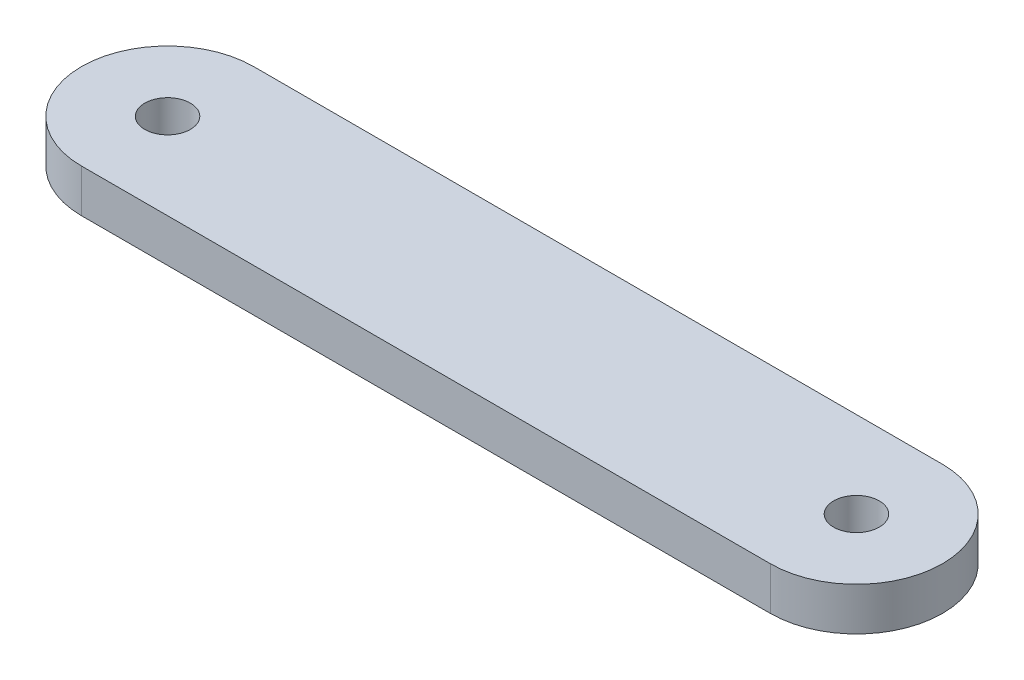
ISO-10303-21;
HEADER;
FILE_DESCRIPTION(('STEP AP214'),'2;1');
FILE_NAME('part.step','',(''),(''),'','','');
FILE_SCHEMA(('AUTOMOTIVE_DESIGN { 1 0 10303 214 1 1 1 1 }'));
ENDSEC;
DATA;
#1=APPLICATION_CONTEXT('core data for automotive mechanical design processes');
#2=APPLICATION_PROTOCOL_DEFINITION('international standard','automotive_design',2000,#1);
#3=PRODUCT_CONTEXT('',#1,'mechanical');
#4=PRODUCT('Part','Part','',(#3));
#5=PRODUCT_RELATED_PRODUCT_CATEGORY('part','',(#4));
#6=PRODUCT_DEFINITION_FORMATION('','',#4);
#7=PRODUCT_DEFINITION_CONTEXT('part definition',#1,'design');
#8=PRODUCT_DEFINITION('design','',#6,#7);
#9=PRODUCT_DEFINITION_SHAPE('','',#8);
#10=(LENGTH_UNIT() NAMED_UNIT(*) SI_UNIT(.MILLI.,.METRE.));
#11=(NAMED_UNIT(*) PLANE_ANGLE_UNIT() SI_UNIT($,.RADIAN.));
#12=(NAMED_UNIT(*) SI_UNIT($,.STERADIAN.) SOLID_ANGLE_UNIT());
#13=UNCERTAINTY_MEASURE_WITH_UNIT(LENGTH_MEASURE(1.E-05),#10,'distance_accuracy_value','');
#14=(GEOMETRIC_REPRESENTATION_CONTEXT(3) GLOBAL_UNCERTAINTY_ASSIGNED_CONTEXT((#13)) GLOBAL_UNIT_ASSIGNED_CONTEXT((#10,
#11,#12)) REPRESENTATION_CONTEXT('',''));
#15=CARTESIAN_POINT('',(0.,0.,0.));
#16=DIRECTION('',(0.,0.,1.));
#17=DIRECTION('',(1.,0.,0.));
#18=AXIS2_PLACEMENT_3D('',#15,#16,#17);
#19=CARTESIAN_POINT('',(0.,5.,0.));
#20=DIRECTION('',(0.,1.,0.));
#21=DIRECTION('',(0.,0.,1.));
#22=AXIS2_PLACEMENT_3D('',#19,#20,#21);
#23=PLANE('',#22);
#24=CARTESIAN_POINT('',(-80.,5.,0.));
#25=DIRECTION('',(0.,1.,0.));
#26=DIRECTION('',(0.,0.,1.));
#27=AXIS2_PLACEMENT_3D('',#24,#25,#26);
#28=CIRCLE('',#27,2.65);
#29=CARTESIAN_POINT('',(-80.,5.,2.65000000000001));
#30=VERTEX_POINT('',#29);
#31=EDGE_CURVE('E106',#30,#30,#28,.T.);
#32=ORIENTED_EDGE('',*,*,#31,.F.);
#33=EDGE_LOOP('',(#32));
#34=FACE_BOUND('',#33,.T.);
#35=CARTESIAN_POINT('',(0.,5.,0.));
#36=DIRECTION('',(0.,1.,0.));
#37=DIRECTION('',(0.,0.,1.));
#38=AXIS2_PLACEMENT_3D('',#35,#36,#37);
#39=CIRCLE('',#38,10.);
#40=CARTESIAN_POINT('',(0.,5.,10.));
#41=VERTEX_POINT('',#40);
#42=CARTESIAN_POINT('',(0.,5.,-10.));
#43=VERTEX_POINT('',#42);
#44=EDGE_CURVE('E91',#41,#43,#39,.T.);
#45=ORIENTED_EDGE('',*,*,#44,.T.);
#46=DIRECTION('',(-1.,0.,0.));
#47=VECTOR('',#46,1.);
#48=CARTESIAN_POINT('',(0.,5.,-10.));
#49=LINE('',#48,#47);
#50=CARTESIAN_POINT('',(-80.,5.,-9.99999999999999));
#51=VERTEX_POINT('',#50);
#52=EDGE_CURVE('E86',#43,#51,#49,.T.);
#53=ORIENTED_EDGE('',*,*,#52,.T.);
#54=CARTESIAN_POINT('',(-80.,5.,0.));
#55=DIRECTION('',(0.,1.,0.));
#56=DIRECTION('',(0.,0.,1.));
#57=AXIS2_PLACEMENT_3D('',#54,#55,#56);
#58=CIRCLE('',#57,10.);
#59=CARTESIAN_POINT('',(-80.,5.,10.));
#60=VERTEX_POINT('',#59);
#61=EDGE_CURVE('E89',#51,#60,#58,.T.);
#62=ORIENTED_EDGE('',*,*,#61,.T.);
#63=DIRECTION('',(1.,0.,0.));
#64=VECTOR('',#63,1.);
#65=CARTESIAN_POINT('',(0.,5.,10.));
#66=LINE('',#65,#64);
#67=EDGE_CURVE('E56',#60,#41,#66,.T.);
#68=ORIENTED_EDGE('',*,*,#67,.T.);
#69=EDGE_LOOP('',(#45,#53,#62,#68));
#70=FACE_BOUND('',#69,.T.);
#71=CARTESIAN_POINT('',(0.,5.,0.));
#72=DIRECTION('',(0.,1.,0.));
#73=DIRECTION('',(0.,0.,1.));
#74=AXIS2_PLACEMENT_3D('',#71,#72,#73);
#75=CIRCLE('',#74,2.65);
#76=CARTESIAN_POINT('',(0.,5.,2.65));
#77=VERTEX_POINT('',#76);
#78=EDGE_CURVE('E121',#77,#77,#75,.T.);
#79=ORIENTED_EDGE('',*,*,#78,.F.);
#80=EDGE_LOOP('',(#79));
#81=FACE_BOUND('',#80,.T.);
#82=ADVANCED_FACE('F39',(#34,#70,#81),#23,.T.);
#83=CARTESIAN_POINT('',(0.,0.,0.));
#84=DIRECTION('',(0.,1.,0.));
#85=DIRECTION('',(0.,0.,1.));
#86=AXIS2_PLACEMENT_3D('',#83,#84,#85);
#87=PLANE('',#86);
#88=CARTESIAN_POINT('',(0.,0.,0.));
#89=DIRECTION('',(0.,1.,0.));
#90=DIRECTION('',(0.,0.,1.));
#91=AXIS2_PLACEMENT_3D('',#88,#89,#90);
#92=CIRCLE('',#91,10.);
#93=CARTESIAN_POINT('',(0.,0.,10.));
#94=VERTEX_POINT('',#93);
#95=CARTESIAN_POINT('',(0.,0.,-10.));
#96=VERTEX_POINT('',#95);
#97=EDGE_CURVE('E103',#94,#96,#92,.T.);
#98=ORIENTED_EDGE('',*,*,#97,.F.);
#99=DIRECTION('',(1.,0.,0.));
#100=VECTOR('',#99,1.);
#101=CARTESIAN_POINT('',(0.,0.,10.));
#102=LINE('',#101,#100);
#103=CARTESIAN_POINT('',(-80.,0.,10.));
#104=VERTEX_POINT('',#103);
#105=EDGE_CURVE('E79',#104,#94,#102,.T.);
#106=ORIENTED_EDGE('',*,*,#105,.F.);
#107=CARTESIAN_POINT('',(-80.,0.,0.));
#108=DIRECTION('',(0.,1.,0.));
#109=DIRECTION('',(0.,0.,1.));
#110=AXIS2_PLACEMENT_3D('',#107,#108,#109);
#111=CIRCLE('',#110,10.);
#112=CARTESIAN_POINT('',(-80.,0.,-9.99999999999999));
#113=VERTEX_POINT('',#112);
#114=EDGE_CURVE('E73',#113,#104,#111,.T.);
#115=ORIENTED_EDGE('',*,*,#114,.F.);
#116=DIRECTION('',(-1.,0.,0.));
#117=VECTOR('',#116,1.);
#118=CARTESIAN_POINT('',(0.,0.,-10.));
#119=LINE('',#118,#117);
#120=EDGE_CURVE('E95',#96,#113,#119,.T.);
#121=ORIENTED_EDGE('',*,*,#120,.F.);
#122=EDGE_LOOP('',(#98,#106,#115,#121));
#123=FACE_BOUND('',#122,.T.);
#124=CARTESIAN_POINT('',(-80.,0.,0.));
#125=DIRECTION('',(0.,1.,0.));
#126=DIRECTION('',(0.,0.,1.));
#127=AXIS2_PLACEMENT_3D('',#124,#125,#126);
#128=CIRCLE('',#127,2.65);
#129=CARTESIAN_POINT('',(-80.,0.,2.65000000000001));
#130=VERTEX_POINT('',#129);
#131=EDGE_CURVE('E118',#130,#130,#128,.T.);
#132=ORIENTED_EDGE('',*,*,#131,.T.);
#133=EDGE_LOOP('',(#132));
#134=FACE_BOUND('',#133,.T.);
#135=CARTESIAN_POINT('',(0.,0.,0.));
#136=DIRECTION('',(0.,1.,0.));
#137=DIRECTION('',(0.,0.,1.));
#138=AXIS2_PLACEMENT_3D('',#135,#136,#137);
#139=CIRCLE('',#138,2.65);
#140=CARTESIAN_POINT('',(0.,0.,2.65));
#141=VERTEX_POINT('',#140);
#142=EDGE_CURVE('E124',#141,#141,#139,.T.);
#143=ORIENTED_EDGE('',*,*,#142,.T.);
#144=EDGE_LOOP('',(#143));
#145=FACE_BOUND('',#144,.T.);
#146=ADVANCED_FACE('F114',(#123,#134,#145),#87,.F.);
#147=CARTESIAN_POINT('',(0.,5.,0.));
#148=DIRECTION('',(0.,-1.,0.));
#149=DIRECTION('',(0.,0.,-1.));
#150=AXIS2_PLACEMENT_3D('',#147,#148,#149);
#151=CYLINDRICAL_SURFACE('',#150,10.);
#152=ORIENTED_EDGE('',*,*,#97,.T.);
#153=DIRECTION('',(0.,-1.,0.));
#154=VECTOR('',#153,1.);
#155=CARTESIAN_POINT('',(0.,5.,-10.));
#156=LINE('',#155,#154);
#157=EDGE_CURVE('E11',#43,#96,#156,.T.);
#158=ORIENTED_EDGE('',*,*,#157,.F.);
#159=ORIENTED_EDGE('',*,*,#44,.F.);
#160=DIRECTION('',(0.,-1.,0.));
#161=VECTOR('',#160,1.);
#162=CARTESIAN_POINT('',(0.,5.,10.));
#163=LINE('',#162,#161);
#164=EDGE_CURVE('E99',#41,#94,#163,.T.);
#165=ORIENTED_EDGE('',*,*,#164,.T.);
#166=EDGE_LOOP('',(#152,#158,#159,#165));
#167=FACE_BOUND('',#166,.T.);
#168=ADVANCED_FACE('F41',(#167),#151,.T.);
#169=CARTESIAN_POINT('',(0.,5.,-10.));
#170=DIRECTION('',(0.,0.,1.));
#171=DIRECTION('',(1.,0.,0.));
#172=AXIS2_PLACEMENT_3D('',#169,#170,#171);
#173=PLANE('',#172);
#174=ORIENTED_EDGE('',*,*,#120,.T.);
#175=DIRECTION('',(0.,-1.,0.));
#176=VECTOR('',#175,1.);
#177=CARTESIAN_POINT('',(-80.,5.,-9.99999999999999));
#178=LINE('',#177,#176);
#179=EDGE_CURVE('E48',#51,#113,#178,.T.);
#180=ORIENTED_EDGE('',*,*,#179,.F.);
#181=ORIENTED_EDGE('',*,*,#52,.F.);
#182=ORIENTED_EDGE('',*,*,#157,.T.);
#183=EDGE_LOOP('',(#174,#180,#181,#182));
#184=FACE_BOUND('',#183,.T.);
#185=ADVANCED_FACE('F94',(#184),#173,.F.);
#186=CARTESIAN_POINT('',(-80.,5.,0.));
#187=DIRECTION('',(0.,-1.,0.));
#188=DIRECTION('',(0.,0.,-1.));
#189=AXIS2_PLACEMENT_3D('',#186,#187,#188);
#190=CYLINDRICAL_SURFACE('',#189,10.);
#191=ORIENTED_EDGE('',*,*,#114,.T.);
#192=DIRECTION('',(0.,-1.,0.));
#193=VECTOR('',#192,1.);
#194=CARTESIAN_POINT('',(-80.,5.,10.));
#195=LINE('',#194,#193);
#196=EDGE_CURVE('E96',#60,#104,#195,.T.);
#197=ORIENTED_EDGE('',*,*,#196,.F.);
#198=ORIENTED_EDGE('',*,*,#61,.F.);
#199=ORIENTED_EDGE('',*,*,#179,.T.);
#200=EDGE_LOOP('',(#191,#197,#198,#199));
#201=FACE_BOUND('',#200,.T.);
#202=ADVANCED_FACE('F97',(#201),#190,.T.);
#203=CARTESIAN_POINT('',(0.,5.,10.));
#204=DIRECTION('',(0.,0.,-1.));
#205=DIRECTION('',(-1.,0.,0.));
#206=AXIS2_PLACEMENT_3D('',#203,#204,#205);
#207=PLANE('',#206);
#208=ORIENTED_EDGE('',*,*,#105,.T.);
#209=ORIENTED_EDGE('',*,*,#164,.F.);
#210=ORIENTED_EDGE('',*,*,#67,.F.);
#211=ORIENTED_EDGE('',*,*,#196,.T.);
#212=EDGE_LOOP('',(#208,#209,#210,#211));
#213=FACE_BOUND('',#212,.T.);
#214=ADVANCED_FACE('F111',(#213),#207,.F.);
#215=CARTESIAN_POINT('',(-80.,5.,0.));
#216=DIRECTION('',(0.,-1.,0.));
#217=DIRECTION('',(0.,0.,-1.));
#218=AXIS2_PLACEMENT_3D('',#215,#216,#217);
#219=CYLINDRICAL_SURFACE('',#218,2.65);
#220=ORIENTED_EDGE('',*,*,#31,.T.);
#221=EDGE_LOOP('',(#220));
#222=FACE_BOUND('',#221,.T.);
#223=ORIENTED_EDGE('',*,*,#131,.F.);
#224=EDGE_LOOP('',(#223));
#225=FACE_BOUND('',#224,.T.);
#226=ADVANCED_FACE('F141',(#222,#225),#219,.F.);
#227=CARTESIAN_POINT('',(0.,5.,0.));
#228=DIRECTION('',(0.,-1.,0.));
#229=DIRECTION('',(0.,0.,-1.));
#230=AXIS2_PLACEMENT_3D('',#227,#228,#229);
#231=CYLINDRICAL_SURFACE('',#230,2.65);
#232=ORIENTED_EDGE('',*,*,#78,.T.);
#233=EDGE_LOOP('',(#232));
#234=FACE_BOUND('',#233,.T.);
#235=ORIENTED_EDGE('',*,*,#142,.F.);
#236=EDGE_LOOP('',(#235));
#237=FACE_BOUND('',#236,.T.);
#238=ADVANCED_FACE('F130',(#234,#237),#231,.F.);
#239=CLOSED_SHELL('',(#82,#146,#168,#185,#202,#214,#226,#238));
#240=MANIFOLD_SOLID_BREP('B2',#239);
#241=ADVANCED_BREP_SHAPE_REPRESENTATION('',(#18,#240),#14);
#242=SHAPE_DEFINITION_REPRESENTATION(#9,#241);
ENDSEC;
END-ISO-10303-21;
